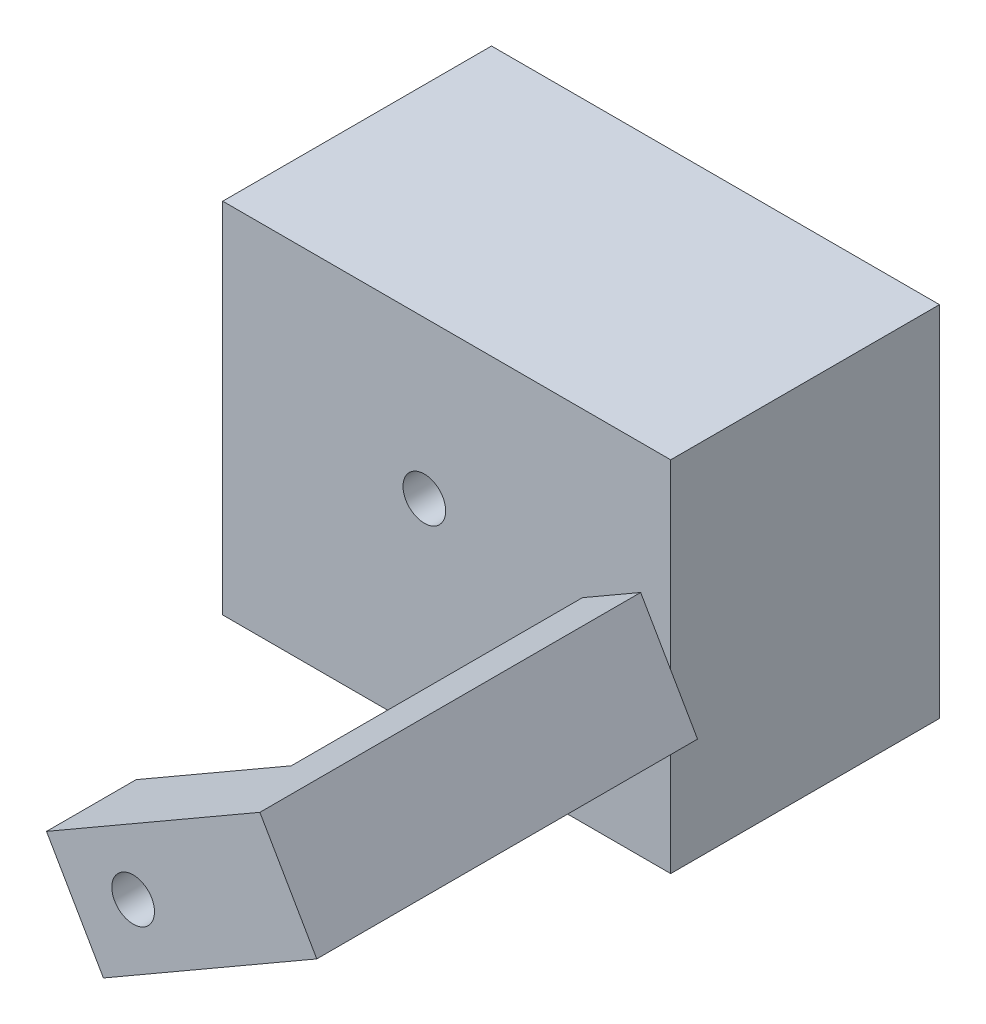
ISO-10303-21;
HEADER;
FILE_DESCRIPTION(('STEP AP214'),'2;1');
FILE_NAME('part.step','',(''),(''),'','','');
FILE_SCHEMA(('AUTOMOTIVE_DESIGN { 1 0 10303 214 1 1 1 1 }'));
ENDSEC;
DATA;
#1=APPLICATION_CONTEXT('core data for automotive mechanical design processes');
#2=APPLICATION_PROTOCOL_DEFINITION('international standard','automotive_design',2000,#1);
#3=PRODUCT_CONTEXT('',#1,'mechanical');
#4=PRODUCT('Part','Part','',(#3));
#5=PRODUCT_RELATED_PRODUCT_CATEGORY('part','',(#4));
#6=PRODUCT_DEFINITION_FORMATION('','',#4);
#7=PRODUCT_DEFINITION_CONTEXT('part definition',#1,'design');
#8=PRODUCT_DEFINITION('design','',#6,#7);
#9=PRODUCT_DEFINITION_SHAPE('','',#8);
#10=(LENGTH_UNIT() NAMED_UNIT(*) SI_UNIT(.MILLI.,.METRE.));
#11=(NAMED_UNIT(*) PLANE_ANGLE_UNIT() SI_UNIT($,.RADIAN.));
#12=(NAMED_UNIT(*) SI_UNIT($,.STERADIAN.) SOLID_ANGLE_UNIT());
#13=UNCERTAINTY_MEASURE_WITH_UNIT(LENGTH_MEASURE(1.E-05),#10,'distance_accuracy_value','');
#14=(GEOMETRIC_REPRESENTATION_CONTEXT(3) GLOBAL_UNCERTAINTY_ASSIGNED_CONTEXT((#13)) GLOBAL_UNIT_ASSIGNED_CONTEXT((#10,
#11,#12)) REPRESENTATION_CONTEXT('',''));
#15=CARTESIAN_POINT('',(0.,0.,0.));
#16=DIRECTION('',(0.,0.,1.));
#17=DIRECTION('',(1.,0.,0.));
#18=AXIS2_PLACEMENT_3D('',#15,#16,#17);
#19=CARTESIAN_POINT('',(30.300635094611,3.49852262806226,115.));
#20=DIRECTION('',(0.866025403784436,0.500000000000004,0.));
#21=DIRECTION('',(-0.500000000000004,0.866025403784436,0.));
#22=AXIS2_PLACEMENT_3D('',#19,#20,#21);
#23=PLANE('',#22);
#24=DIRECTION('',(0.500000000000005,-0.866025403784436,0.));
#25=VECTOR('',#24,1.);
#26=CARTESIAN_POINT('',(43.0006350946111,-18.4985226280625,95.));
#27=LINE('',#26,#25);
#28=CARTESIAN_POINT('',(30.300635094611,3.49852262806227,95.));
#29=VERTEX_POINT('',#28);
#30=CARTESIAN_POINT('',(43.0006350946111,-18.4985226280625,95.));
#31=VERTEX_POINT('',#30);
#32=EDGE_CURVE('E157',#29,#31,#27,.T.);
#33=ORIENTED_EDGE('',*,*,#32,.F.);
#34=DIRECTION('',(0.,0.,-1.));
#35=VECTOR('',#34,1.);
#36=CARTESIAN_POINT('',(30.300635094611,3.49852262806226,115.));
#37=LINE('',#36,#35);
#38=CARTESIAN_POINT('',(30.300635094611,3.49852262806226,30.));
#39=VERTEX_POINT('',#38);
#40=EDGE_CURVE('E205',#29,#39,#37,.T.);
#41=ORIENTED_EDGE('',*,*,#40,.T.);
#42=DIRECTION('',(0.500000000000004,-0.866025403784436,0.));
#43=VECTOR('',#42,1.);
#44=CARTESIAN_POINT('',(30.300635094611,3.49852262806226,30.));
#45=LINE('',#44,#43);
#46=CARTESIAN_POINT('',(43.0006350946111,-18.4985226280625,30.));
#47=VERTEX_POINT('',#46);
#48=EDGE_CURVE('E193',#39,#47,#45,.T.);
#49=ORIENTED_EDGE('',*,*,#48,.T.);
#50=DIRECTION('',(0.,0.,-1.));
#51=VECTOR('',#50,1.);
#52=CARTESIAN_POINT('',(43.0006350946111,-18.4985226280625,115.));
#53=LINE('',#52,#51);
#54=EDGE_CURVE('E59',#31,#47,#53,.T.);
#55=ORIENTED_EDGE('',*,*,#54,.F.);
#56=EDGE_LOOP('',(#33,#41,#49,#55));
#57=FACE_BOUND('',#56,.T.);
#58=ADVANCED_FACE('F41',(#57),#23,.F.);
#59=CARTESIAN_POINT('',(50.,40.,30.));
#60=DIRECTION('',(0.,0.,-1.));
#61=DIRECTION('',(-1.,0.,0.));
#62=AXIS2_PLACEMENT_3D('',#59,#60,#61);
#63=PLANE('',#62);
#64=CARTESIAN_POINT('',(-5.,5.,30.));
#65=DIRECTION('',(0.,0.,1.));
#66=DIRECTION('',(1.,0.,0.));
#67=AXIS2_PLACEMENT_3D('',#64,#65,#66);
#68=CIRCLE('',#67,4.7625);
#69=CARTESIAN_POINT('',(-0.237500000000005,5.,30.));
#70=VERTEX_POINT('',#69);
#71=EDGE_CURVE('E163',#70,#70,#68,.T.);
#72=ORIENTED_EDGE('',*,*,#71,.F.);
#73=EDGE_LOOP('',(#72));
#74=FACE_BOUND('',#73,.T.);
#75=CARTESIAN_POINT('',(15.,-20.,30.));
#76=DIRECTION('',(0.,0.,-1.));
#77=DIRECTION('',(-1.,0.,0.));
#78=AXIS2_PLACEMENT_3D('',#75,#76,#77);
#79=CIRCLE('',#78,4.7625);
#80=CARTESIAN_POINT('',(10.2375,-20.,30.));
#81=VERTEX_POINT('',#80);
#82=EDGE_CURVE('E179',#81,#81,#79,.T.);
#83=ORIENTED_EDGE('',*,*,#82,.T.);
#84=EDGE_LOOP('',(#83));
#85=FACE_BOUND('',#84,.T.);
#86=DIRECTION('',(-0.500000000000005,0.866025403784436,0.));
#87=VECTOR('',#86,1.);
#88=CARTESIAN_POINT('',(55.9910161513776,-10.9985226280623,30.));
#89=LINE('',#88,#87);
#90=CARTESIAN_POINT('',(50.,-0.621778264910667,30.));
#91=VERTEX_POINT('',#90);
#92=CARTESIAN_POINT('',(43.2910161513775,10.9985226280623,30.));
#93=VERTEX_POINT('',#92);
#94=EDGE_CURVE('E11',#91,#93,#89,.T.);
#95=ORIENTED_EDGE('',*,*,#94,.F.);
#96=DIRECTION('',(0.,-1.,0.));
#97=VECTOR('',#96,1.);
#98=CARTESIAN_POINT('',(50.,40.,30.));
#99=LINE('',#98,#97);
#100=CARTESIAN_POINT('',(50.,40.,30.));
#101=VERTEX_POINT('',#100);
#102=EDGE_CURVE('E239',#101,#91,#99,.T.);
#103=ORIENTED_EDGE('',*,*,#102,.F.);
#104=DIRECTION('',(1.,0.,0.));
#105=VECTOR('',#104,1.);
#106=CARTESIAN_POINT('',(50.,40.,30.));
#107=LINE('',#106,#105);
#108=CARTESIAN_POINT('',(-50.,40.,30.));
#109=VERTEX_POINT('',#108);
#110=EDGE_CURVE('E223',#109,#101,#107,.T.);
#111=ORIENTED_EDGE('',*,*,#110,.F.);
#112=DIRECTION('',(0.,-1.,0.));
#113=VECTOR('',#112,1.);
#114=CARTESIAN_POINT('',(-50.,40.,30.));
#115=LINE('',#114,#113);
#116=CARTESIAN_POINT('',(-50.,-40.,30.));
#117=VERTEX_POINT('',#116);
#118=EDGE_CURVE('E243',#109,#117,#115,.T.);
#119=ORIENTED_EDGE('',*,*,#118,.T.);
#120=DIRECTION('',(1.,0.,0.));
#121=VECTOR('',#120,1.);
#122=CARTESIAN_POINT('',(50.,-40.,30.));
#123=LINE('',#122,#121);
#124=CARTESIAN_POINT('',(50.,-40.,30.));
#125=VERTEX_POINT('',#124);
#126=EDGE_CURVE('E217',#117,#125,#123,.T.);
#127=ORIENTED_EDGE('',*,*,#126,.T.);
#128=CARTESIAN_POINT('',(50.,-14.4574374157797,30.));
#129=VERTEX_POINT('',#128);
#130=EDGE_CURVE('E226',#129,#125,#99,.T.);
#131=ORIENTED_EDGE('',*,*,#130,.F.);
#132=DIRECTION('',(0.866025403784434,0.500000000000009,0.));
#133=VECTOR('',#132,1.);
#134=CARTESIAN_POINT('',(43.0006350946111,-18.4985226280625,30.));
#135=LINE('',#134,#133);
#136=EDGE_CURVE('E184',#47,#129,#135,.T.);
#137=ORIENTED_EDGE('',*,*,#136,.F.);
#138=ORIENTED_EDGE('',*,*,#48,.F.);
#139=DIRECTION('',(-0.866025403784436,-0.500000000000005,0.));
#140=VECTOR('',#139,1.);
#141=CARTESIAN_POINT('',(43.2910161513775,10.9985226280623,30.));
#142=LINE('',#141,#140);
#143=EDGE_CURVE('E67',#93,#39,#142,.T.);
#144=ORIENTED_EDGE('',*,*,#143,.F.);
#145=EDGE_LOOP('',(#95,#103,#111,#119,#127,#131,#137,#138,#144));
#146=FACE_BOUND('',#145,.T.);
#147=ADVANCED_FACE('F269',(#74,#85,#146),#63,.F.);
#148=CARTESIAN_POINT('',(50.,40.,30.));
#149=DIRECTION('',(-1.,0.,0.));
#150=DIRECTION('',(0.,0.,1.));
#151=AXIS2_PLACEMENT_3D('',#148,#149,#150);
#152=PLANE('',#151);
#153=DIRECTION('',(0.,0.,-1.));
#154=VECTOR('',#153,1.);
#155=CARTESIAN_POINT('',(50.,-40.,30.));
#156=LINE('',#155,#154);
#157=CARTESIAN_POINT('',(50.,-40.,-30.));
#158=VERTEX_POINT('',#157);
#159=EDGE_CURVE('E211',#125,#158,#156,.T.);
#160=ORIENTED_EDGE('',*,*,#159,.T.);
#161=DIRECTION('',(0.,-1.,0.));
#162=VECTOR('',#161,1.);
#163=CARTESIAN_POINT('',(50.,40.,-30.));
#164=LINE('',#163,#162);
#165=CARTESIAN_POINT('',(50.,40.,-30.));
#166=VERTEX_POINT('',#165);
#167=EDGE_CURVE('E45',#166,#158,#164,.T.);
#168=ORIENTED_EDGE('',*,*,#167,.F.);
#169=DIRECTION('',(0.,0.,-1.));
#170=VECTOR('',#169,1.);
#171=CARTESIAN_POINT('',(50.,40.,30.));
#172=LINE('',#171,#170);
#173=EDGE_CURVE('E212',#101,#166,#172,.T.);
#174=ORIENTED_EDGE('',*,*,#173,.F.);
#175=ORIENTED_EDGE('',*,*,#102,.T.);
#176=EDGE_CURVE('E244',#91,#129,#99,.T.);
#177=ORIENTED_EDGE('',*,*,#176,.T.);
#178=ORIENTED_EDGE('',*,*,#130,.T.);
#179=EDGE_LOOP('',(#160,#168,#174,#175,#177,#178));
#180=FACE_BOUND('',#179,.T.);
#181=ADVANCED_FACE('F43',(#180),#152,.F.);
#182=CARTESIAN_POINT('',(50.,40.,-30.));
#183=DIRECTION('',(0.,0.,1.));
#184=DIRECTION('',(1.,0.,0.));
#185=AXIS2_PLACEMENT_3D('',#182,#183,#184);
#186=PLANE('',#185);
#187=CARTESIAN_POINT('',(-5.,5.,-30.));
#188=DIRECTION('',(0.,0.,1.));
#189=DIRECTION('',(1.,0.,0.));
#190=AXIS2_PLACEMENT_3D('',#187,#188,#189);
#191=CIRCLE('',#190,4.7625);
#192=CARTESIAN_POINT('',(-0.237500000000005,5.,-30.));
#193=VERTEX_POINT('',#192);
#194=EDGE_CURVE('E160',#193,#193,#191,.T.);
#195=ORIENTED_EDGE('',*,*,#194,.T.);
#196=EDGE_LOOP('',(#195));
#197=FACE_BOUND('',#196,.T.);
#198=CARTESIAN_POINT('',(15.,-20.,-30.));
#199=DIRECTION('',(0.,0.,1.));
#200=DIRECTION('',(1.,0.,0.));
#201=AXIS2_PLACEMENT_3D('',#198,#199,#200);
#202=CIRCLE('',#201,4.7625);
#203=CARTESIAN_POINT('',(19.7625,-20.,-30.));
#204=VERTEX_POINT('',#203);
#205=EDGE_CURVE('E175',#204,#204,#202,.T.);
#206=ORIENTED_EDGE('',*,*,#205,.T.);
#207=EDGE_LOOP('',(#206));
#208=FACE_BOUND('',#207,.T.);
#209=DIRECTION('',(-1.,0.,0.));
#210=VECTOR('',#209,1.);
#211=CARTESIAN_POINT('',(50.,-40.,-30.));
#212=LINE('',#211,#210);
#213=CARTESIAN_POINT('',(-50.,-40.,-30.));
#214=VERTEX_POINT('',#213);
#215=EDGE_CURVE('E230',#158,#214,#212,.T.);
#216=ORIENTED_EDGE('',*,*,#215,.T.);
#217=DIRECTION('',(0.,-1.,0.));
#218=VECTOR('',#217,1.);
#219=CARTESIAN_POINT('',(-50.,40.,-30.));
#220=LINE('',#219,#218);
#221=CARTESIAN_POINT('',(-50.,40.,-30.));
#222=VERTEX_POINT('',#221);
#223=EDGE_CURVE('E247',#222,#214,#220,.T.);
#224=ORIENTED_EDGE('',*,*,#223,.F.);
#225=DIRECTION('',(-1.,0.,0.));
#226=VECTOR('',#225,1.);
#227=CARTESIAN_POINT('',(50.,40.,-30.));
#228=LINE('',#227,#226);
#229=EDGE_CURVE('E216',#166,#222,#228,.T.);
#230=ORIENTED_EDGE('',*,*,#229,.F.);
#231=ORIENTED_EDGE('',*,*,#167,.T.);
#232=EDGE_LOOP('',(#216,#224,#230,#231));
#233=FACE_BOUND('',#232,.T.);
#234=ADVANCED_FACE('F258',(#197,#208,#233),#186,.F.);
#235=CARTESIAN_POINT('',(-50.,40.,30.));
#236=DIRECTION('',(1.,0.,0.));
#237=DIRECTION('',(0.,0.,-1.));
#238=AXIS2_PLACEMENT_3D('',#235,#236,#237);
#239=PLANE('',#238);
#240=DIRECTION('',(0.,0.,1.));
#241=VECTOR('',#240,1.);
#242=CARTESIAN_POINT('',(-50.,-40.,30.));
#243=LINE('',#242,#241);
#244=EDGE_CURVE('E233',#214,#117,#243,.T.);
#245=ORIENTED_EDGE('',*,*,#244,.T.);
#246=ORIENTED_EDGE('',*,*,#118,.F.);
#247=DIRECTION('',(0.,0.,1.));
#248=VECTOR('',#247,1.);
#249=CARTESIAN_POINT('',(-50.,40.,30.));
#250=LINE('',#249,#248);
#251=EDGE_CURVE('E220',#222,#109,#250,.T.);
#252=ORIENTED_EDGE('',*,*,#251,.F.);
#253=ORIENTED_EDGE('',*,*,#223,.T.);
#254=EDGE_LOOP('',(#245,#246,#252,#253));
#255=FACE_BOUND('',#254,.T.);
#256=ADVANCED_FACE('F267',(#255),#239,.F.);
#257=CARTESIAN_POINT('',(0.,40.,0.));
#258=DIRECTION('',(0.,1.,0.));
#259=DIRECTION('',(0.,0.,1.));
#260=AXIS2_PLACEMENT_3D('',#257,#258,#259);
#261=PLANE('',#260);
#262=ORIENTED_EDGE('',*,*,#173,.T.);
#263=ORIENTED_EDGE('',*,*,#229,.T.);
#264=ORIENTED_EDGE('',*,*,#251,.T.);
#265=ORIENTED_EDGE('',*,*,#110,.T.);
#266=EDGE_LOOP('',(#262,#263,#264,#265));
#267=FACE_BOUND('',#266,.T.);
#268=ADVANCED_FACE('F272',(#267),#261,.T.);
#269=CARTESIAN_POINT('',(0.,-40.,0.));
#270=DIRECTION('',(0.,1.,0.));
#271=DIRECTION('',(0.,0.,1.));
#272=AXIS2_PLACEMENT_3D('',#269,#270,#271);
#273=PLANE('',#272);
#274=ORIENTED_EDGE('',*,*,#159,.F.);
#275=ORIENTED_EDGE('',*,*,#126,.F.);
#276=ORIENTED_EDGE('',*,*,#244,.F.);
#277=ORIENTED_EDGE('',*,*,#215,.F.);
#278=EDGE_LOOP('',(#274,#275,#276,#277));
#279=FACE_BOUND('',#278,.T.);
#280=ADVANCED_FACE('F265',(#279),#273,.F.);
#281=CARTESIAN_POINT('',(55.9910161513776,-10.9985226280623,115.));
#282=DIRECTION('',(-0.866025403784436,-0.500000000000005,0.));
#283=DIRECTION('',(0.500000000000005,-0.866025403784436,0.));
#284=AXIS2_PLACEMENT_3D('',#281,#282,#283);
#285=PLANE('',#284);
#286=CARTESIAN_POINT('',(55.9910161513776,-10.9985226280623,30.));
#287=VERTEX_POINT('',#286);
#288=EDGE_CURVE('E52',#287,#91,#89,.T.);
#289=ORIENTED_EDGE('',*,*,#288,.T.);
#290=ORIENTED_EDGE('',*,*,#94,.T.);
#291=DIRECTION('',(0.,0.,-1.));
#292=VECTOR('',#291,1.);
#293=CARTESIAN_POINT('',(43.2910161513775,10.9985226280623,115.));
#294=LINE('',#293,#292);
#295=CARTESIAN_POINT('',(43.2910161513775,10.9985226280623,115.));
#296=VERTEX_POINT('',#295);
#297=EDGE_CURVE('E208',#296,#93,#294,.T.);
#298=ORIENTED_EDGE('',*,*,#297,.F.);
#299=DIRECTION('',(-0.500000000000005,0.866025403784436,0.));
#300=VECTOR('',#299,1.);
#301=CARTESIAN_POINT('',(55.9910161513776,-10.9985226280623,115.));
#302=LINE('',#301,#300);
#303=CARTESIAN_POINT('',(55.9910161513776,-10.9985226280623,115.));
#304=VERTEX_POINT('',#303);
#305=EDGE_CURVE('E135',#304,#296,#302,.T.);
#306=ORIENTED_EDGE('',*,*,#305,.F.);
#307=DIRECTION('',(0.,0.,-1.));
#308=VECTOR('',#307,1.);
#309=CARTESIAN_POINT('',(55.9910161513776,-10.9985226280623,115.));
#310=LINE('',#309,#308);
#311=EDGE_CURVE('E187',#304,#287,#310,.T.);
#312=ORIENTED_EDGE('',*,*,#311,.T.);
#313=EDGE_LOOP('',(#289,#290,#298,#306,#312));
#314=FACE_BOUND('',#313,.T.);
#315=ADVANCED_FACE('F280',(#314),#285,.F.);
#316=CARTESIAN_POINT('',(43.2910161513775,10.9985226280623,115.));
#317=DIRECTION('',(0.500000000000004,-0.866025403784436,0.));
#318=DIRECTION('',(0.866025403784436,0.500000000000005,0.));
#319=AXIS2_PLACEMENT_3D('',#316,#317,#318);
#320=PLANE('',#319);
#321=ORIENTED_EDGE('',*,*,#143,.T.);
#322=ORIENTED_EDGE('',*,*,#40,.F.);
#323=DIRECTION('',(0.866025403784436,0.500000000000005,0.));
#324=VECTOR('',#323,1.);
#325=CARTESIAN_POINT('',(-4.34038105676645,-16.5014773719379,95.));
#326=LINE('',#325,#324);
#327=CARTESIAN_POINT('',(-4.34038105676645,-16.5014773719379,95.));
#328=VERTEX_POINT('',#327);
#329=EDGE_CURVE('E146',#328,#29,#326,.T.);
#330=ORIENTED_EDGE('',*,*,#329,.F.);
#331=DIRECTION('',(0.,0.,-1.));
#332=VECTOR('',#331,1.);
#333=CARTESIAN_POINT('',(-4.34038105676645,-16.5014773719379,115.));
#334=LINE('',#333,#332);
#335=CARTESIAN_POINT('',(-4.34038105676645,-16.5014773719379,115.));
#336=VERTEX_POINT('',#335);
#337=EDGE_CURVE('E143',#336,#328,#334,.T.);
#338=ORIENTED_EDGE('',*,*,#337,.F.);
#339=DIRECTION('',(-0.866025403784436,-0.500000000000005,0.));
#340=VECTOR('',#339,1.);
#341=CARTESIAN_POINT('',(43.2910161513775,10.9985226280623,115.));
#342=LINE('',#341,#340);
#343=EDGE_CURVE('E129',#296,#336,#342,.T.);
#344=ORIENTED_EDGE('',*,*,#343,.F.);
#345=ORIENTED_EDGE('',*,*,#297,.T.);
#346=EDGE_LOOP('',(#321,#322,#330,#338,#344,#345));
#347=FACE_BOUND('',#346,.T.);
#348=ADVANCED_FACE('F144',(#347),#320,.F.);
#349=CARTESIAN_POINT('',(43.0006350946111,-18.4985226280625,115.));
#350=DIRECTION('',(-0.500000000000009,0.866025403784434,0.));
#351=DIRECTION('',(-0.866025403784434,-0.500000000000009,0.));
#352=AXIS2_PLACEMENT_3D('',#349,#350,#351);
#353=PLANE('',#352);
#354=ORIENTED_EDGE('',*,*,#136,.T.);
#355=EDGE_CURVE('E197',#129,#287,#135,.T.);
#356=ORIENTED_EDGE('',*,*,#355,.T.);
#357=ORIENTED_EDGE('',*,*,#311,.F.);
#358=DIRECTION('',(0.866025403784434,0.500000000000009,0.));
#359=VECTOR('',#358,1.);
#360=CARTESIAN_POINT('',(43.0006350946111,-18.4985226280625,115.));
#361=LINE('',#360,#359);
#362=CARTESIAN_POINT('',(8.35961894323371,-38.4985226280627,115.));
#363=VERTEX_POINT('',#362);
#364=EDGE_CURVE('E140',#363,#304,#361,.T.);
#365=ORIENTED_EDGE('',*,*,#364,.F.);
#366=DIRECTION('',(0.,0.,1.));
#367=VECTOR('',#366,1.);
#368=CARTESIAN_POINT('',(8.35961894323371,-38.4985226280627,115.));
#369=LINE('',#368,#367);
#370=CARTESIAN_POINT('',(8.35961894323371,-38.4985226280627,95.));
#371=VERTEX_POINT('',#370);
#372=EDGE_CURVE('E155',#371,#363,#369,.T.);
#373=ORIENTED_EDGE('',*,*,#372,.F.);
#374=DIRECTION('',(0.866025403784436,0.500000000000005,0.));
#375=VECTOR('',#374,1.);
#376=CARTESIAN_POINT('',(8.35961894323371,-38.4985226280627,95.));
#377=LINE('',#376,#375);
#378=EDGE_CURVE('E169',#371,#31,#377,.T.);
#379=ORIENTED_EDGE('',*,*,#378,.T.);
#380=ORIENTED_EDGE('',*,*,#54,.T.);
#381=EDGE_LOOP('',(#354,#356,#357,#365,#373,#379,#380));
#382=FACE_BOUND('',#381,.T.);
#383=ADVANCED_FACE('F282',(#382),#353,.F.);
#384=CARTESIAN_POINT('',(0.,0.,115.));
#385=DIRECTION('',(0.,0.,1.));
#386=DIRECTION('',(1.,0.,0.));
#387=AXIS2_PLACEMENT_3D('',#384,#385,#386);
#388=PLANE('',#387);
#389=CARTESIAN_POINT('',(15.,-20.,115.));
#390=DIRECTION('',(0.,0.,1.));
#391=DIRECTION('',(1.,0.,0.));
#392=AXIS2_PLACEMENT_3D('',#389,#390,#391);
#393=CIRCLE('',#392,4.7625);
#394=CARTESIAN_POINT('',(19.7625,-20.,115.));
#395=VERTEX_POINT('',#394);
#396=EDGE_CURVE('E338',#395,#395,#393,.T.);
#397=ORIENTED_EDGE('',*,*,#396,.F.);
#398=EDGE_LOOP('',(#397));
#399=FACE_BOUND('',#398,.T.);
#400=ORIENTED_EDGE('',*,*,#305,.T.);
#401=ORIENTED_EDGE('',*,*,#343,.T.);
#402=DIRECTION('',(-0.500000000000005,0.866025403784436,0.));
#403=VECTOR('',#402,1.);
#404=CARTESIAN_POINT('',(8.35961894323371,-38.4985226280627,115.));
#405=LINE('',#404,#403);
#406=EDGE_CURVE('E133',#363,#336,#405,.T.);
#407=ORIENTED_EDGE('',*,*,#406,.F.);
#408=ORIENTED_EDGE('',*,*,#364,.T.);
#409=EDGE_LOOP('',(#400,#401,#407,#408));
#410=FACE_BOUND('',#409,.T.);
#411=ADVANCED_FACE('F131',(#399,#410),#388,.T.);
#412=CARTESIAN_POINT('',(0.,0.,30.));
#413=DIRECTION('',(0.,0.,1.));
#414=DIRECTION('',(1.,0.,0.));
#415=AXIS2_PLACEMENT_3D('',#412,#413,#414);
#416=PLANE('',#415);
#417=ORIENTED_EDGE('',*,*,#176,.F.);
#418=ORIENTED_EDGE('',*,*,#288,.F.);
#419=ORIENTED_EDGE('',*,*,#355,.F.);
#420=EDGE_LOOP('',(#417,#418,#419));
#421=FACE_BOUND('',#420,.T.);
#422=ADVANCED_FACE('F277',(#421),#416,.F.);
#423=CARTESIAN_POINT('',(15.,-20.,-30.));
#424=DIRECTION('',(0.,0.,1.));
#425=DIRECTION('',(1.,0.,0.));
#426=AXIS2_PLACEMENT_3D('',#423,#424,#425);
#427=CYLINDRICAL_SURFACE('',#426,4.7625);
#428=ORIENTED_EDGE('',*,*,#205,.F.);
#429=EDGE_LOOP('',(#428));
#430=FACE_BOUND('',#429,.T.);
#431=ORIENTED_EDGE('',*,*,#82,.F.);
#432=EDGE_LOOP('',(#431));
#433=FACE_BOUND('',#432,.T.);
#434=ADVANCED_FACE('F291',(#430,#433),#427,.F.);
#435=CARTESIAN_POINT('',(8.35961894323371,-38.4985226280627,95.));
#436=DIRECTION('',(0.,0.,1.));
#437=DIRECTION('',(1.,0.,0.));
#438=AXIS2_PLACEMENT_3D('',#435,#436,#437);
#439=PLANE('',#438);
#440=CARTESIAN_POINT('',(15.,-20.,95.));
#441=DIRECTION('',(0.,0.,-1.));
#442=DIRECTION('',(-1.,0.,0.));
#443=AXIS2_PLACEMENT_3D('',#440,#441,#442);
#444=CIRCLE('',#443,4.7625);
#445=CARTESIAN_POINT('',(10.2375,-20.,95.));
#446=VERTEX_POINT('',#445);
#447=EDGE_CURVE('E343',#446,#446,#444,.T.);
#448=ORIENTED_EDGE('',*,*,#447,.F.);
#449=EDGE_LOOP('',(#448));
#450=FACE_BOUND('',#449,.T.);
#451=ORIENTED_EDGE('',*,*,#32,.T.);
#452=ORIENTED_EDGE('',*,*,#378,.F.);
#453=DIRECTION('',(0.500000000000005,-0.866025403784436,0.));
#454=VECTOR('',#453,1.);
#455=CARTESIAN_POINT('',(8.35961894323371,-38.4985226280627,95.));
#456=LINE('',#455,#454);
#457=EDGE_CURVE('E150',#328,#371,#456,.T.);
#458=ORIENTED_EDGE('',*,*,#457,.F.);
#459=ORIENTED_EDGE('',*,*,#329,.T.);
#460=EDGE_LOOP('',(#451,#452,#458,#459));
#461=FACE_BOUND('',#460,.T.);
#462=ADVANCED_FACE('F289',(#450,#461),#439,.F.);
#463=CARTESIAN_POINT('',(-10.400635094611,-6.00480947161681,0.));
#464=DIRECTION('',(-0.866025403784436,-0.500000000000005,0.));
#465=DIRECTION('',(0.500000000000005,-0.866025403784436,0.));
#466=AXIS2_PLACEMENT_3D('',#463,#464,#465);
#467=PLANE('',#466);
#468=ORIENTED_EDGE('',*,*,#406,.T.);
#469=ORIENTED_EDGE('',*,*,#337,.T.);
#470=ORIENTED_EDGE('',*,*,#457,.T.);
#471=ORIENTED_EDGE('',*,*,#372,.T.);
#472=EDGE_LOOP('',(#468,#469,#470,#471));
#473=FACE_BOUND('',#472,.T.);
#474=ADVANCED_FACE('F153',(#473),#467,.T.);
#475=CARTESIAN_POINT('',(-5.,5.,-30.));
#476=DIRECTION('',(0.,0.,1.));
#477=DIRECTION('',(1.,0.,0.));
#478=AXIS2_PLACEMENT_3D('',#475,#476,#477);
#479=CYLINDRICAL_SURFACE('',#478,4.7625);
#480=ORIENTED_EDGE('',*,*,#194,.F.);
#481=EDGE_LOOP('',(#480));
#482=FACE_BOUND('',#481,.T.);
#483=ORIENTED_EDGE('',*,*,#71,.T.);
#484=EDGE_LOOP('',(#483));
#485=FACE_BOUND('',#484,.T.);
#486=ADVANCED_FACE('F298',(#482,#485),#479,.F.);
#487=CARTESIAN_POINT('',(15.,-20.,135.));
#488=DIRECTION('',(0.,0.,-1.));
#489=DIRECTION('',(-1.,0.,0.));
#490=AXIS2_PLACEMENT_3D('',#487,#488,#489);
#491=CYLINDRICAL_SURFACE('',#490,4.7625);
#492=ORIENTED_EDGE('',*,*,#396,.T.);
#493=EDGE_LOOP('',(#492));
#494=FACE_BOUND('',#493,.T.);
#495=ORIENTED_EDGE('',*,*,#447,.T.);
#496=EDGE_LOOP('',(#495));
#497=FACE_BOUND('',#496,.T.);
#498=ADVANCED_FACE('F347',(#494,#497),#491,.F.);
#499=CLOSED_SHELL('',(#58,#147,#181,#234,#256,#268,#280,#315,#348,#383,#411,#422,#434,#462,#474,
#486,#498));
#500=MANIFOLD_SOLID_BREP('B2',#499);
#501=ADVANCED_BREP_SHAPE_REPRESENTATION('',(#18,#500),#14);
#502=SHAPE_DEFINITION_REPRESENTATION(#9,#501);
ENDSEC;
END-ISO-10303-21;
